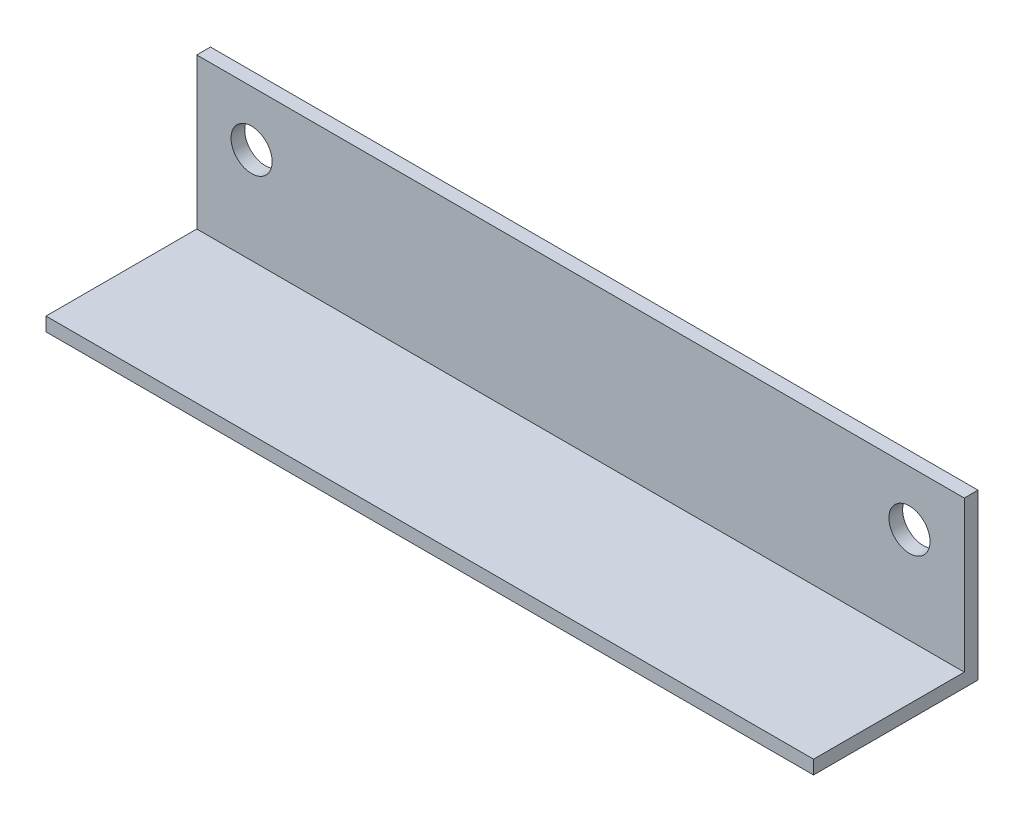
ISO-10303-21;
HEADER;
FILE_DESCRIPTION(('STEP AP214'),'2;1');
FILE_NAME('part.step','',(''),(''),'','','');
FILE_SCHEMA(('AUTOMOTIVE_DESIGN { 1 0 10303 214 1 1 1 1 }'));
ENDSEC;
DATA;
#1=APPLICATION_CONTEXT('core data for automotive mechanical design processes');
#2=APPLICATION_PROTOCOL_DEFINITION('international standard','automotive_design',2000,#1);
#3=PRODUCT_CONTEXT('',#1,'mechanical');
#4=PRODUCT('Part','Part','',(#3));
#5=PRODUCT_RELATED_PRODUCT_CATEGORY('part','',(#4));
#6=PRODUCT_DEFINITION_FORMATION('','',#4);
#7=PRODUCT_DEFINITION_CONTEXT('part definition',#1,'design');
#8=PRODUCT_DEFINITION('design','',#6,#7);
#9=PRODUCT_DEFINITION_SHAPE('','',#8);
#10=(LENGTH_UNIT() NAMED_UNIT(*) SI_UNIT(.MILLI.,.METRE.));
#11=(NAMED_UNIT(*) PLANE_ANGLE_UNIT() SI_UNIT($,.RADIAN.));
#12=(NAMED_UNIT(*) SI_UNIT($,.STERADIAN.) SOLID_ANGLE_UNIT());
#13=UNCERTAINTY_MEASURE_WITH_UNIT(LENGTH_MEASURE(1.E-05),#10,'distance_accuracy_value','');
#14=(GEOMETRIC_REPRESENTATION_CONTEXT(3) GLOBAL_UNCERTAINTY_ASSIGNED_CONTEXT((#13)) GLOBAL_UNIT_ASSIGNED_CONTEXT((#10,
#11,#12)) REPRESENTATION_CONTEXT('',''));
#15=CARTESIAN_POINT('',(0.,0.,0.));
#16=DIRECTION('',(0.,0.,1.));
#17=DIRECTION('',(1.,0.,0.));
#18=AXIS2_PLACEMENT_3D('',#15,#16,#17);
#19=CARTESIAN_POINT('',(88.9,0.,0.));
#20=DIRECTION('',(0.,0.,1.));
#21=DIRECTION('',(1.,0.,0.));
#22=AXIS2_PLACEMENT_3D('',#19,#20,#21);
#23=PLANE('',#22);
#24=CARTESIAN_POINT('',(76.2,25.4,0.));
#25=DIRECTION('',(0.,0.,-1.));
#26=DIRECTION('',(-1.,0.,0.));
#27=AXIS2_PLACEMENT_3D('',#24,#25,#26);
#28=CIRCLE('',#27,4.7625);
#29=CARTESIAN_POINT('',(71.4375,25.4,0.));
#30=VERTEX_POINT('',#29);
#31=EDGE_CURVE('E120',#30,#30,#28,.T.);
#32=ORIENTED_EDGE('',*,*,#31,.F.);
#33=EDGE_LOOP('',(#32));
#34=FACE_BOUND('',#33,.T.);
#35=CARTESIAN_POINT('',(-76.2,25.4,0.));
#36=DIRECTION('',(0.,0.,-1.));
#37=DIRECTION('',(-1.,0.,0.));
#38=AXIS2_PLACEMENT_3D('',#35,#36,#37);
#39=CIRCLE('',#38,4.7625);
#40=CARTESIAN_POINT('',(-80.9625,25.4,0.));
#41=VERTEX_POINT('',#40);
#42=EDGE_CURVE('E165',#41,#41,#39,.T.);
#43=ORIENTED_EDGE('',*,*,#42,.F.);
#44=EDGE_LOOP('',(#43));
#45=FACE_BOUND('',#44,.T.);
#46=DIRECTION('',(0.,1.,0.));
#47=VECTOR('',#46,1.);
#48=CARTESIAN_POINT('',(-88.9,0.,0.));
#49=LINE('',#48,#47);
#50=CARTESIAN_POINT('',(-88.9,0.,0.));
#51=VERTEX_POINT('',#50);
#52=CARTESIAN_POINT('',(-88.9,38.1,0.));
#53=VERTEX_POINT('',#52);
#54=EDGE_CURVE('E116',#51,#53,#49,.T.);
#55=ORIENTED_EDGE('',*,*,#54,.T.);
#56=DIRECTION('',(-1.,0.,0.));
#57=VECTOR('',#56,1.);
#58=CARTESIAN_POINT('',(88.9,38.1,0.));
#59=LINE('',#58,#57);
#60=CARTESIAN_POINT('',(88.9,38.1,0.));
#61=VERTEX_POINT('',#60);
#62=EDGE_CURVE('E11',#61,#53,#59,.T.);
#63=ORIENTED_EDGE('',*,*,#62,.F.);
#64=DIRECTION('',(0.,1.,0.));
#65=VECTOR('',#64,1.);
#66=CARTESIAN_POINT('',(88.9,0.,0.));
#67=LINE('',#66,#65);
#68=CARTESIAN_POINT('',(88.9,0.,0.));
#69=VERTEX_POINT('',#68);
#70=EDGE_CURVE('E81',#69,#61,#67,.T.);
#71=ORIENTED_EDGE('',*,*,#70,.F.);
#72=DIRECTION('',(-1.,0.,0.));
#73=VECTOR('',#72,1.);
#74=CARTESIAN_POINT('',(88.9,0.,0.));
#75=LINE('',#74,#73);
#76=EDGE_CURVE('E112',#69,#51,#75,.T.);
#77=ORIENTED_EDGE('',*,*,#76,.T.);
#78=EDGE_LOOP('',(#55,#63,#71,#77));
#79=FACE_BOUND('',#78,.T.);
#80=ADVANCED_FACE('F35',(#34,#45,#79),#23,.F.);
#81=CARTESIAN_POINT('',(88.9,38.1,3.175));
#82=DIRECTION('',(0.,1.,0.));
#83=DIRECTION('',(0.,0.,1.));
#84=AXIS2_PLACEMENT_3D('',#81,#82,#83);
#85=PLANE('',#84);
#86=DIRECTION('',(0.,0.,-1.));
#87=VECTOR('',#86,1.);
#88=CARTESIAN_POINT('',(-88.9,38.1,3.175));
#89=LINE('',#88,#87);
#90=CARTESIAN_POINT('',(-88.9,38.1,3.175));
#91=VERTEX_POINT('',#90);
#92=EDGE_CURVE('E119',#91,#53,#89,.T.);
#93=ORIENTED_EDGE('',*,*,#92,.F.);
#94=DIRECTION('',(-1.,0.,0.));
#95=VECTOR('',#94,1.);
#96=CARTESIAN_POINT('',(88.9,38.1,3.175));
#97=LINE('',#96,#95);
#98=CARTESIAN_POINT('',(88.9,38.1,3.175));
#99=VERTEX_POINT('',#98);
#100=EDGE_CURVE('E43',#99,#91,#97,.T.);
#101=ORIENTED_EDGE('',*,*,#100,.F.);
#102=DIRECTION('',(0.,0.,-1.));
#103=VECTOR('',#102,1.);
#104=CARTESIAN_POINT('',(88.9,38.1,3.175));
#105=LINE('',#104,#103);
#106=EDGE_CURVE('E177',#99,#61,#105,.T.);
#107=ORIENTED_EDGE('',*,*,#106,.T.);
#108=ORIENTED_EDGE('',*,*,#62,.T.);
#109=EDGE_LOOP('',(#93,#101,#107,#108));
#110=FACE_BOUND('',#109,.T.);
#111=ADVANCED_FACE('F138',(#110),#85,.T.);
#112=CARTESIAN_POINT('',(88.9,0.,3.175));
#113=DIRECTION('',(0.,0.,1.));
#114=DIRECTION('',(1.,0.,0.));
#115=AXIS2_PLACEMENT_3D('',#112,#113,#114);
#116=PLANE('',#115);
#117=CARTESIAN_POINT('',(76.2,25.4,3.175));
#118=DIRECTION('',(0.,0.,1.));
#119=DIRECTION('',(1.,0.,0.));
#120=AXIS2_PLACEMENT_3D('',#117,#118,#119);
#121=CIRCLE('',#120,4.7625);
#122=CARTESIAN_POINT('',(80.9625,25.4,3.175));
#123=VERTEX_POINT('',#122);
#124=EDGE_CURVE('E167',#123,#123,#121,.F.);
#125=ORIENTED_EDGE('',*,*,#124,.T.);
#126=EDGE_LOOP('',(#125));
#127=FACE_BOUND('',#126,.T.);
#128=CARTESIAN_POINT('',(-76.2,25.4,3.175));
#129=DIRECTION('',(0.,0.,1.));
#130=DIRECTION('',(1.,0.,0.));
#131=AXIS2_PLACEMENT_3D('',#128,#129,#130);
#132=CIRCLE('',#131,4.7625);
#133=CARTESIAN_POINT('',(-71.4375,25.4,3.175));
#134=VERTEX_POINT('',#133);
#135=EDGE_CURVE('E168',#134,#134,#132,.F.);
#136=ORIENTED_EDGE('',*,*,#135,.T.);
#137=EDGE_LOOP('',(#136));
#138=FACE_BOUND('',#137,.T.);
#139=DIRECTION('',(0.,1.,0.));
#140=VECTOR('',#139,1.);
#141=CARTESIAN_POINT('',(-88.9,0.,3.175));
#142=LINE('',#141,#140);
#143=CARTESIAN_POINT('',(-88.9,3.175,3.175));
#144=VERTEX_POINT('',#143);
#145=EDGE_CURVE('E123',#144,#91,#142,.T.);
#146=ORIENTED_EDGE('',*,*,#145,.F.);
#147=DIRECTION('',(-1.,0.,0.));
#148=VECTOR('',#147,1.);
#149=CARTESIAN_POINT('',(88.9,3.175,3.175));
#150=LINE('',#149,#148);
#151=CARTESIAN_POINT('',(88.9,3.175,3.175));
#152=VERTEX_POINT('',#151);
#153=EDGE_CURVE('E102',#152,#144,#150,.T.);
#154=ORIENTED_EDGE('',*,*,#153,.F.);
#155=DIRECTION('',(0.,1.,0.));
#156=VECTOR('',#155,1.);
#157=CARTESIAN_POINT('',(88.9,0.,3.175));
#158=LINE('',#157,#156);
#159=EDGE_CURVE('E108',#152,#99,#158,.T.);
#160=ORIENTED_EDGE('',*,*,#159,.T.);
#161=ORIENTED_EDGE('',*,*,#100,.T.);
#162=EDGE_LOOP('',(#146,#154,#160,#161));
#163=FACE_BOUND('',#162,.T.);
#164=ADVANCED_FACE('F135',(#127,#138,#163),#116,.T.);
#165=CARTESIAN_POINT('',(88.9,3.175,38.1));
#166=DIRECTION('',(0.,1.,0.));
#167=DIRECTION('',(0.,0.,1.));
#168=AXIS2_PLACEMENT_3D('',#165,#166,#167);
#169=PLANE('',#168);
#170=DIRECTION('',(0.,0.,-1.));
#171=VECTOR('',#170,1.);
#172=CARTESIAN_POINT('',(-88.9,3.175,38.1));
#173=LINE('',#172,#171);
#174=CARTESIAN_POINT('',(-88.9,3.175,38.1));
#175=VERTEX_POINT('',#174);
#176=EDGE_CURVE('E97',#175,#144,#173,.T.);
#177=ORIENTED_EDGE('',*,*,#176,.F.);
#178=DIRECTION('',(-1.,0.,0.));
#179=VECTOR('',#178,1.);
#180=CARTESIAN_POINT('',(88.9,3.175,38.1));
#181=LINE('',#180,#179);
#182=CARTESIAN_POINT('',(88.9,3.175,38.1));
#183=VERTEX_POINT('',#182);
#184=EDGE_CURVE('E92',#183,#175,#181,.T.);
#185=ORIENTED_EDGE('',*,*,#184,.F.);
#186=DIRECTION('',(0.,0.,-1.));
#187=VECTOR('',#186,1.);
#188=CARTESIAN_POINT('',(88.9,3.175,38.1));
#189=LINE('',#188,#187);
#190=EDGE_CURVE('E95',#183,#152,#189,.T.);
#191=ORIENTED_EDGE('',*,*,#190,.T.);
#192=ORIENTED_EDGE('',*,*,#153,.T.);
#193=EDGE_LOOP('',(#177,#185,#191,#192));
#194=FACE_BOUND('',#193,.T.);
#195=ADVANCED_FACE('F94',(#194),#169,.T.);
#196=CARTESIAN_POINT('',(88.9,0.,38.1));
#197=DIRECTION('',(0.,0.,1.));
#198=DIRECTION('',(1.,0.,0.));
#199=AXIS2_PLACEMENT_3D('',#196,#197,#198);
#200=PLANE('',#199);
#201=DIRECTION('',(0.,1.,0.));
#202=VECTOR('',#201,1.);
#203=CARTESIAN_POINT('',(-88.9,0.,38.1));
#204=LINE('',#203,#202);
#205=CARTESIAN_POINT('',(-88.9,0.,38.1));
#206=VERTEX_POINT('',#205);
#207=EDGE_CURVE('E127',#206,#175,#204,.T.);
#208=ORIENTED_EDGE('',*,*,#207,.F.);
#209=DIRECTION('',(-1.,0.,0.));
#210=VECTOR('',#209,1.);
#211=CARTESIAN_POINT('',(88.9,0.,38.1));
#212=LINE('',#211,#210);
#213=CARTESIAN_POINT('',(88.9,0.,38.1));
#214=VERTEX_POINT('',#213);
#215=EDGE_CURVE('E72',#214,#206,#212,.T.);
#216=ORIENTED_EDGE('',*,*,#215,.F.);
#217=DIRECTION('',(0.,1.,0.));
#218=VECTOR('',#217,1.);
#219=CARTESIAN_POINT('',(88.9,0.,38.1));
#220=LINE('',#219,#218);
#221=EDGE_CURVE('E106',#214,#183,#220,.T.);
#222=ORIENTED_EDGE('',*,*,#221,.T.);
#223=ORIENTED_EDGE('',*,*,#184,.T.);
#224=EDGE_LOOP('',(#208,#216,#222,#223));
#225=FACE_BOUND('',#224,.T.);
#226=ADVANCED_FACE('F110',(#225),#200,.T.);
#227=CARTESIAN_POINT('',(88.9,0.,38.1));
#228=DIRECTION('',(0.,1.,0.));
#229=DIRECTION('',(0.,0.,1.));
#230=AXIS2_PLACEMENT_3D('',#227,#228,#229);
#231=PLANE('',#230);
#232=DIRECTION('',(0.,0.,-1.));
#233=VECTOR('',#232,1.);
#234=CARTESIAN_POINT('',(-88.9,0.,38.1));
#235=LINE('',#234,#233);
#236=EDGE_CURVE('E75',#206,#51,#235,.T.);
#237=ORIENTED_EDGE('',*,*,#236,.T.);
#238=ORIENTED_EDGE('',*,*,#76,.F.);
#239=DIRECTION('',(0.,0.,-1.));
#240=VECTOR('',#239,1.);
#241=CARTESIAN_POINT('',(88.9,0.,38.1));
#242=LINE('',#241,#240);
#243=EDGE_CURVE('E51',#214,#69,#242,.T.);
#244=ORIENTED_EDGE('',*,*,#243,.F.);
#245=ORIENTED_EDGE('',*,*,#215,.T.);
#246=EDGE_LOOP('',(#237,#238,#244,#245));
#247=FACE_BOUND('',#246,.T.);
#248=ADVANCED_FACE('F143',(#247),#231,.F.);
#249=CARTESIAN_POINT('',(88.9,0.,0.));
#250=DIRECTION('',(-1.,0.,0.));
#251=DIRECTION('',(0.,0.,1.));
#252=AXIS2_PLACEMENT_3D('',#249,#250,#251);
#253=PLANE('',#252);
#254=ORIENTED_EDGE('',*,*,#70,.T.);
#255=ORIENTED_EDGE('',*,*,#106,.F.);
#256=ORIENTED_EDGE('',*,*,#159,.F.);
#257=ORIENTED_EDGE('',*,*,#190,.F.);
#258=ORIENTED_EDGE('',*,*,#221,.F.);
#259=ORIENTED_EDGE('',*,*,#243,.T.);
#260=EDGE_LOOP('',(#254,#255,#256,#257,#258,#259));
#261=FACE_BOUND('',#260,.T.);
#262=ADVANCED_FACE('F105',(#261),#253,.F.);
#263=CARTESIAN_POINT('',(-88.9,0.,0.));
#264=DIRECTION('',(-1.,0.,0.));
#265=DIRECTION('',(0.,0.,1.));
#266=AXIS2_PLACEMENT_3D('',#263,#264,#265);
#267=PLANE('',#266);
#268=ORIENTED_EDGE('',*,*,#54,.F.);
#269=ORIENTED_EDGE('',*,*,#236,.F.);
#270=ORIENTED_EDGE('',*,*,#207,.T.);
#271=ORIENTED_EDGE('',*,*,#176,.T.);
#272=ORIENTED_EDGE('',*,*,#145,.T.);
#273=ORIENTED_EDGE('',*,*,#92,.T.);
#274=EDGE_LOOP('',(#268,#269,#270,#271,#272,#273));
#275=FACE_BOUND('',#274,.T.);
#276=ADVANCED_FACE('F141',(#275),#267,.T.);
#277=CARTESIAN_POINT('',(-76.2,25.4,38.101));
#278=DIRECTION('',(0.,0.,-1.));
#279=DIRECTION('',(-1.,0.,0.));
#280=AXIS2_PLACEMENT_3D('',#277,#278,#279);
#281=CYLINDRICAL_SURFACE('',#280,4.7625);
#282=ORIENTED_EDGE('',*,*,#135,.F.);
#283=EDGE_LOOP('',(#282));
#284=FACE_BOUND('',#283,.T.);
#285=ORIENTED_EDGE('',*,*,#42,.T.);
#286=EDGE_LOOP('',(#285));
#287=FACE_BOUND('',#286,.T.);
#288=ADVANCED_FACE('F181',(#284,#287),#281,.F.);
#289=CARTESIAN_POINT('',(76.2,25.4,38.101));
#290=DIRECTION('',(0.,0.,-1.));
#291=DIRECTION('',(-1.,0.,0.));
#292=AXIS2_PLACEMENT_3D('',#289,#290,#291);
#293=CYLINDRICAL_SURFACE('',#292,4.7625);
#294=ORIENTED_EDGE('',*,*,#124,.F.);
#295=EDGE_LOOP('',(#294));
#296=FACE_BOUND('',#295,.T.);
#297=ORIENTED_EDGE('',*,*,#31,.T.);
#298=EDGE_LOOP('',(#297));
#299=FACE_BOUND('',#298,.T.);
#300=ADVANCED_FACE('F179',(#296,#299),#293,.F.);
#301=CLOSED_SHELL('',(#80,#111,#164,#195,#226,#248,#262,#276,#288,#300));
#302=MANIFOLD_SOLID_BREP('B2',#301);
#303=ADVANCED_BREP_SHAPE_REPRESENTATION('',(#18,#302),#14);
#304=SHAPE_DEFINITION_REPRESENTATION(#9,#303);
ENDSEC;
END-ISO-10303-21;
